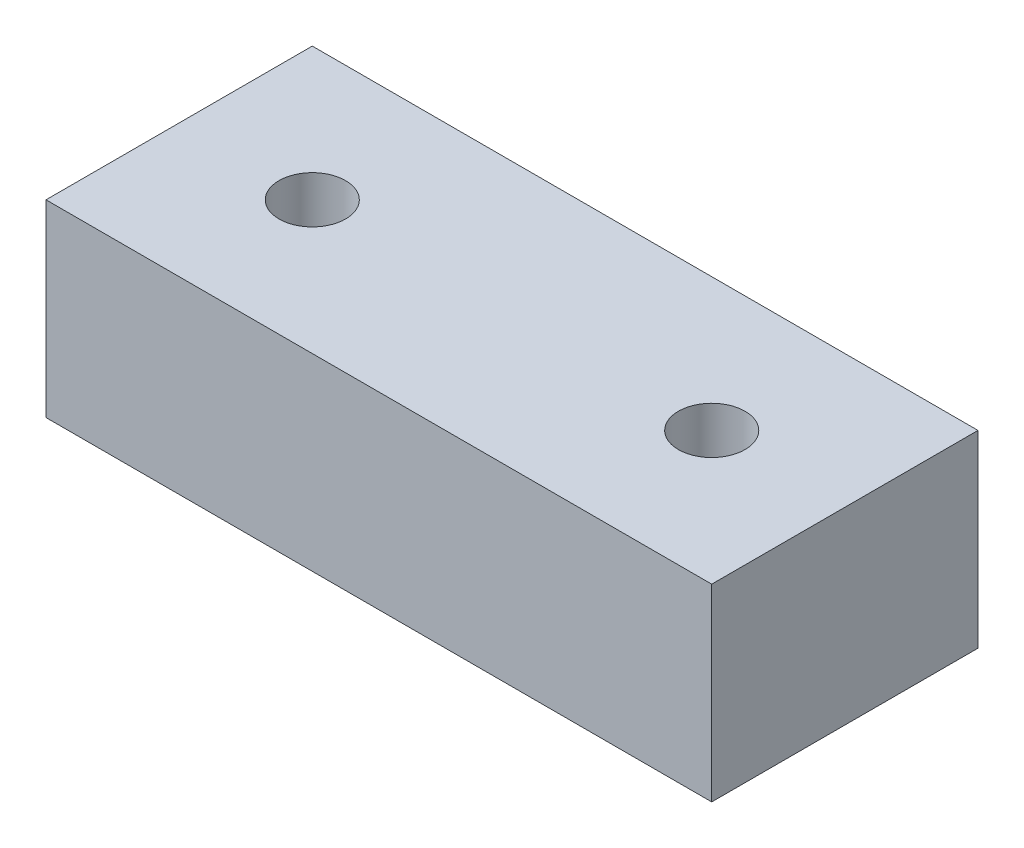
ISO-10303-21;
HEADER;
FILE_DESCRIPTION(('STEP AP214'),'2;1');
FILE_NAME('part.step','',(''),(''),'','','');
FILE_SCHEMA(('AUTOMOTIVE_DESIGN { 1 0 10303 214 1 1 1 1 }'));
ENDSEC;
DATA;
#1=APPLICATION_CONTEXT('core data for automotive mechanical design processes');
#2=APPLICATION_PROTOCOL_DEFINITION('international standard','automotive_design',2000,#1);
#3=PRODUCT_CONTEXT('',#1,'mechanical');
#4=PRODUCT('Part','Part','',(#3));
#5=PRODUCT_RELATED_PRODUCT_CATEGORY('part','',(#4));
#6=PRODUCT_DEFINITION_FORMATION('','',#4);
#7=PRODUCT_DEFINITION_CONTEXT('part definition',#1,'design');
#8=PRODUCT_DEFINITION('design','',#6,#7);
#9=PRODUCT_DEFINITION_SHAPE('','',#8);
#10=(LENGTH_UNIT() NAMED_UNIT(*) SI_UNIT(.MILLI.,.METRE.));
#11=(NAMED_UNIT(*) PLANE_ANGLE_UNIT() SI_UNIT($,.RADIAN.));
#12=(NAMED_UNIT(*) SI_UNIT($,.STERADIAN.) SOLID_ANGLE_UNIT());
#13=UNCERTAINTY_MEASURE_WITH_UNIT(LENGTH_MEASURE(1.E-05),#10,'distance_accuracy_value','');
#14=(GEOMETRIC_REPRESENTATION_CONTEXT(3) GLOBAL_UNCERTAINTY_ASSIGNED_CONTEXT((#13)) GLOBAL_UNIT_ASSIGNED_CONTEXT((#10,
#11,#12)) REPRESENTATION_CONTEXT('',''));
#15=CARTESIAN_POINT('',(0.,0.,0.));
#16=DIRECTION('',(0.,0.,1.));
#17=DIRECTION('',(1.,0.,0.));
#18=AXIS2_PLACEMENT_3D('',#15,#16,#17);
#19=CARTESIAN_POINT('',(-15.,8.5,-6.));
#20=DIRECTION('',(1.,0.,0.));
#21=DIRECTION('',(0.,0.,-1.));
#22=AXIS2_PLACEMENT_3D('',#19,#20,#21);
#23=PLANE('',#22);
#24=DIRECTION('',(0.,0.,1.));
#25=VECTOR('',#24,1.);
#26=CARTESIAN_POINT('',(-15.,0.,-6.));
#27=LINE('',#26,#25);
#28=CARTESIAN_POINT('',(-15.,0.,-6.));
#29=VERTEX_POINT('',#28);
#30=CARTESIAN_POINT('',(-15.,0.,6.));
#31=VERTEX_POINT('',#30);
#32=EDGE_CURVE('E96',#29,#31,#27,.T.);
#33=ORIENTED_EDGE('',*,*,#32,.T.);
#34=DIRECTION('',(0.,-1.,0.));
#35=VECTOR('',#34,1.);
#36=CARTESIAN_POINT('',(-15.,8.5,6.));
#37=LINE('',#36,#35);
#38=CARTESIAN_POINT('',(-15.,8.5,6.));
#39=VERTEX_POINT('',#38);
#40=EDGE_CURVE('E11',#39,#31,#37,.T.);
#41=ORIENTED_EDGE('',*,*,#40,.F.);
#42=DIRECTION('',(0.,0.,1.));
#43=VECTOR('',#42,1.);
#44=CARTESIAN_POINT('',(-15.,8.5,-6.));
#45=LINE('',#44,#43);
#46=CARTESIAN_POINT('',(-15.,8.5,-6.));
#47=VERTEX_POINT('',#46);
#48=EDGE_CURVE('E84',#47,#39,#45,.T.);
#49=ORIENTED_EDGE('',*,*,#48,.F.);
#50=DIRECTION('',(0.,-1.,0.));
#51=VECTOR('',#50,1.);
#52=CARTESIAN_POINT('',(-15.,8.5,-6.));
#53=LINE('',#52,#51);
#54=EDGE_CURVE('E92',#47,#29,#53,.T.);
#55=ORIENTED_EDGE('',*,*,#54,.T.);
#56=EDGE_LOOP('',(#33,#41,#49,#55));
#57=FACE_BOUND('',#56,.T.);
#58=ADVANCED_FACE('F33',(#57),#23,.F.);
#59=CARTESIAN_POINT('',(15.,8.5,6.));
#60=DIRECTION('',(0.,0.,-1.));
#61=DIRECTION('',(-1.,0.,0.));
#62=AXIS2_PLACEMENT_3D('',#59,#60,#61);
#63=PLANE('',#62);
#64=DIRECTION('',(1.,0.,0.));
#65=VECTOR('',#64,1.);
#66=CARTESIAN_POINT('',(15.,0.,6.));
#67=LINE('',#66,#65);
#68=CARTESIAN_POINT('',(15.,0.,6.));
#69=VERTEX_POINT('',#68);
#70=EDGE_CURVE('E88',#31,#69,#67,.T.);
#71=ORIENTED_EDGE('',*,*,#70,.T.);
#72=DIRECTION('',(0.,-1.,0.));
#73=VECTOR('',#72,1.);
#74=CARTESIAN_POINT('',(15.,8.5,6.));
#75=LINE('',#74,#73);
#76=CARTESIAN_POINT('',(15.,8.5,6.));
#77=VERTEX_POINT('',#76);
#78=EDGE_CURVE('E41',#77,#69,#75,.T.);
#79=ORIENTED_EDGE('',*,*,#78,.F.);
#80=DIRECTION('',(1.,0.,0.));
#81=VECTOR('',#80,1.);
#82=CARTESIAN_POINT('',(15.,8.5,6.));
#83=LINE('',#82,#81);
#84=EDGE_CURVE('E79',#39,#77,#83,.T.);
#85=ORIENTED_EDGE('',*,*,#84,.F.);
#86=ORIENTED_EDGE('',*,*,#40,.T.);
#87=EDGE_LOOP('',(#71,#79,#85,#86));
#88=FACE_BOUND('',#87,.T.);
#89=ADVANCED_FACE('F87',(#88),#63,.F.);
#90=CARTESIAN_POINT('',(15.,8.5,-6.));
#91=DIRECTION('',(-1.,0.,0.));
#92=DIRECTION('',(0.,0.,1.));
#93=AXIS2_PLACEMENT_3D('',#90,#91,#92);
#94=PLANE('',#93);
#95=DIRECTION('',(0.,0.,-1.));
#96=VECTOR('',#95,1.);
#97=CARTESIAN_POINT('',(15.,0.,-6.));
#98=LINE('',#97,#96);
#99=CARTESIAN_POINT('',(15.,0.,-6.));
#100=VERTEX_POINT('',#99);
#101=EDGE_CURVE('E66',#69,#100,#98,.T.);
#102=ORIENTED_EDGE('',*,*,#101,.T.);
#103=DIRECTION('',(0.,-1.,0.));
#104=VECTOR('',#103,1.);
#105=CARTESIAN_POINT('',(15.,8.5,-6.));
#106=LINE('',#105,#104);
#107=CARTESIAN_POINT('',(15.,8.5,-6.));
#108=VERTEX_POINT('',#107);
#109=EDGE_CURVE('E89',#108,#100,#106,.T.);
#110=ORIENTED_EDGE('',*,*,#109,.F.);
#111=DIRECTION('',(0.,0.,-1.));
#112=VECTOR('',#111,1.);
#113=CARTESIAN_POINT('',(15.,8.5,-6.));
#114=LINE('',#113,#112);
#115=EDGE_CURVE('E82',#77,#108,#114,.T.);
#116=ORIENTED_EDGE('',*,*,#115,.F.);
#117=ORIENTED_EDGE('',*,*,#78,.T.);
#118=EDGE_LOOP('',(#102,#110,#116,#117));
#119=FACE_BOUND('',#118,.T.);
#120=ADVANCED_FACE('F90',(#119),#94,.F.);
#121=CARTESIAN_POINT('',(15.,8.5,-6.));
#122=DIRECTION('',(0.,0.,1.));
#123=DIRECTION('',(1.,0.,0.));
#124=AXIS2_PLACEMENT_3D('',#121,#122,#123);
#125=PLANE('',#124);
#126=DIRECTION('',(-1.,0.,0.));
#127=VECTOR('',#126,1.);
#128=CARTESIAN_POINT('',(15.,0.,-6.));
#129=LINE('',#128,#127);
#130=EDGE_CURVE('E72',#100,#29,#129,.T.);
#131=ORIENTED_EDGE('',*,*,#130,.T.);
#132=ORIENTED_EDGE('',*,*,#54,.F.);
#133=DIRECTION('',(-1.,0.,0.));
#134=VECTOR('',#133,1.);
#135=CARTESIAN_POINT('',(15.,8.5,-6.));
#136=LINE('',#135,#134);
#137=EDGE_CURVE('E49',#108,#47,#136,.T.);
#138=ORIENTED_EDGE('',*,*,#137,.F.);
#139=ORIENTED_EDGE('',*,*,#109,.T.);
#140=EDGE_LOOP('',(#131,#132,#138,#139));
#141=FACE_BOUND('',#140,.T.);
#142=ADVANCED_FACE('F104',(#141),#125,.F.);
#143=CARTESIAN_POINT('',(0.,8.5,0.));
#144=DIRECTION('',(0.,-1.,0.));
#145=DIRECTION('',(0.,0.,-1.));
#146=AXIS2_PLACEMENT_3D('',#143,#144,#145);
#147=PLANE('',#146);
#148=CARTESIAN_POINT('',(-9.,8.5,0.));
#149=DIRECTION('',(0.,1.,0.));
#150=DIRECTION('',(0.,0.,1.));
#151=AXIS2_PLACEMENT_3D('',#148,#149,#150);
#152=CIRCLE('',#151,1.5);
#153=CARTESIAN_POINT('',(-9.,8.5,1.5));
#154=VERTEX_POINT('',#153);
#155=EDGE_CURVE('E116',#154,#154,#152,.T.);
#156=ORIENTED_EDGE('',*,*,#155,.F.);
#157=EDGE_LOOP('',(#156));
#158=FACE_BOUND('',#157,.T.);
#159=CARTESIAN_POINT('',(9.,8.5,0.));
#160=DIRECTION('',(0.,1.,0.));
#161=DIRECTION('',(0.,0.,1.));
#162=AXIS2_PLACEMENT_3D('',#159,#160,#161);
#163=CIRCLE('',#162,1.5);
#164=CARTESIAN_POINT('',(9.,8.5,1.5));
#165=VERTEX_POINT('',#164);
#166=EDGE_CURVE('E110',#165,#165,#163,.T.);
#167=ORIENTED_EDGE('',*,*,#166,.F.);
#168=EDGE_LOOP('',(#167));
#169=FACE_BOUND('',#168,.T.);
#170=ORIENTED_EDGE('',*,*,#48,.T.);
#171=ORIENTED_EDGE('',*,*,#84,.T.);
#172=ORIENTED_EDGE('',*,*,#115,.T.);
#173=ORIENTED_EDGE('',*,*,#137,.T.);
#174=EDGE_LOOP('',(#170,#171,#172,#173));
#175=FACE_BOUND('',#174,.T.);
#176=ADVANCED_FACE('F80',(#158,#169,#175),#147,.F.);
#177=CARTESIAN_POINT('',(0.,0.,0.));
#178=DIRECTION('',(0.,-1.,0.));
#179=DIRECTION('',(0.,0.,-1.));
#180=AXIS2_PLACEMENT_3D('',#177,#178,#179);
#181=PLANE('',#180);
#182=CARTESIAN_POINT('',(-9.,0.,0.));
#183=DIRECTION('',(0.,1.,0.));
#184=DIRECTION('',(0.,0.,1.));
#185=AXIS2_PLACEMENT_3D('',#182,#183,#184);
#186=CIRCLE('',#185,1.5);
#187=CARTESIAN_POINT('',(-9.,0.,1.5));
#188=VERTEX_POINT('',#187);
#189=EDGE_CURVE('E99',#188,#188,#186,.T.);
#190=ORIENTED_EDGE('',*,*,#189,.T.);
#191=EDGE_LOOP('',(#190));
#192=FACE_BOUND('',#191,.T.);
#193=CARTESIAN_POINT('',(9.,0.,0.));
#194=DIRECTION('',(0.,1.,0.));
#195=DIRECTION('',(0.,0.,1.));
#196=AXIS2_PLACEMENT_3D('',#193,#194,#195);
#197=CIRCLE('',#196,1.5);
#198=CARTESIAN_POINT('',(9.,0.,1.5));
#199=VERTEX_POINT('',#198);
#200=EDGE_CURVE('E113',#199,#199,#197,.T.);
#201=ORIENTED_EDGE('',*,*,#200,.T.);
#202=EDGE_LOOP('',(#201));
#203=FACE_BOUND('',#202,.T.);
#204=ORIENTED_EDGE('',*,*,#32,.F.);
#205=ORIENTED_EDGE('',*,*,#130,.F.);
#206=ORIENTED_EDGE('',*,*,#101,.F.);
#207=ORIENTED_EDGE('',*,*,#70,.F.);
#208=EDGE_LOOP('',(#204,#205,#206,#207));
#209=FACE_BOUND('',#208,.T.);
#210=ADVANCED_FACE('F107',(#192,#203,#209),#181,.T.);
#211=CARTESIAN_POINT('',(9.,0.,0.));
#212=DIRECTION('',(0.,1.,0.));
#213=DIRECTION('',(0.,0.,1.));
#214=AXIS2_PLACEMENT_3D('',#211,#212,#213);
#215=CYLINDRICAL_SURFACE('',#214,1.5);
#216=ORIENTED_EDGE('',*,*,#200,.F.);
#217=EDGE_LOOP('',(#216));
#218=FACE_BOUND('',#217,.T.);
#219=ORIENTED_EDGE('',*,*,#166,.T.);
#220=EDGE_LOOP('',(#219));
#221=FACE_BOUND('',#220,.T.);
#222=ADVANCED_FACE('F127',(#218,#221),#215,.F.);
#223=CARTESIAN_POINT('',(-9.,0.,0.));
#224=DIRECTION('',(0.,1.,0.));
#225=DIRECTION('',(0.,0.,1.));
#226=AXIS2_PLACEMENT_3D('',#223,#224,#225);
#227=CYLINDRICAL_SURFACE('',#226,1.5);
#228=ORIENTED_EDGE('',*,*,#189,.F.);
#229=EDGE_LOOP('',(#228));
#230=FACE_BOUND('',#229,.T.);
#231=ORIENTED_EDGE('',*,*,#155,.T.);
#232=EDGE_LOOP('',(#231));
#233=FACE_BOUND('',#232,.T.);
#234=ADVANCED_FACE('F124',(#230,#233),#227,.F.);
#235=CLOSED_SHELL('',(#58,#89,#120,#142,#176,#210,#222,#234));
#236=MANIFOLD_SOLID_BREP('B2',#235);
#237=ADVANCED_BREP_SHAPE_REPRESENTATION('',(#18,#236),#14);
#238=SHAPE_DEFINITION_REPRESENTATION(#9,#237);
ENDSEC;
END-ISO-10303-21;
